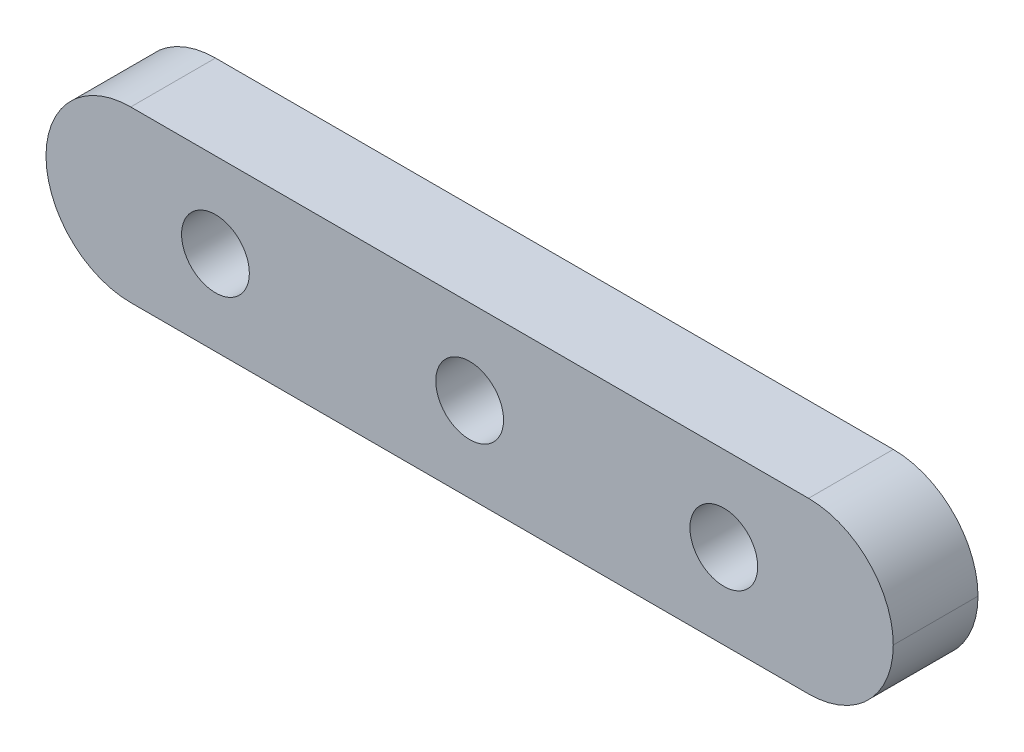
ISO-10303-21;
HEADER;
FILE_DESCRIPTION(('STEP AP214'),'2;1');
FILE_NAME('part.step','',(''),(''),'','','');
FILE_SCHEMA(('AUTOMOTIVE_DESIGN { 1 0 10303 214 1 1 1 1 }'));
ENDSEC;
DATA;
#1=APPLICATION_CONTEXT('core data for automotive mechanical design processes');
#2=APPLICATION_PROTOCOL_DEFINITION('international standard','automotive_design',2000,#1);
#3=PRODUCT_CONTEXT('',#1,'mechanical');
#4=PRODUCT('Part','Part','',(#3));
#5=PRODUCT_RELATED_PRODUCT_CATEGORY('part','',(#4));
#6=PRODUCT_DEFINITION_FORMATION('','',#4);
#7=PRODUCT_DEFINITION_CONTEXT('part definition',#1,'design');
#8=PRODUCT_DEFINITION('design','',#6,#7);
#9=PRODUCT_DEFINITION_SHAPE('','',#8);
#10=(LENGTH_UNIT() NAMED_UNIT(*) SI_UNIT(.MILLI.,.METRE.));
#11=(NAMED_UNIT(*) PLANE_ANGLE_UNIT() SI_UNIT($,.RADIAN.));
#12=(NAMED_UNIT(*) SI_UNIT($,.STERADIAN.) SOLID_ANGLE_UNIT());
#13=UNCERTAINTY_MEASURE_WITH_UNIT(LENGTH_MEASURE(1.E-05),#10,'distance_accuracy_value','');
#14=(GEOMETRIC_REPRESENTATION_CONTEXT(3) GLOBAL_UNCERTAINTY_ASSIGNED_CONTEXT((#13)) GLOBAL_UNIT_ASSIGNED_CONTEXT((#10,
#11,#12)) REPRESENTATION_CONTEXT('',''));
#15=CARTESIAN_POINT('',(0.,0.,0.));
#16=DIRECTION('',(0.,0.,1.));
#17=DIRECTION('',(1.,0.,0.));
#18=AXIS2_PLACEMENT_3D('',#15,#16,#17);
#19=CARTESIAN_POINT('',(0.,0.,5.));
#20=DIRECTION('',(0.,0.,1.));
#21=DIRECTION('',(1.,0.,0.));
#22=AXIS2_PLACEMENT_3D('',#19,#20,#21);
#23=PLANE('',#22);
#24=CARTESIAN_POINT('',(15.,0.,5.));
#25=DIRECTION('',(0.,0.,1.));
#26=DIRECTION('',(-1.,0.,0.));
#27=AXIS2_PLACEMENT_3D('',#24,#25,#26);
#28=CIRCLE('',#27,2.);
#29=CARTESIAN_POINT('',(13.,0.,5.));
#30=VERTEX_POINT('',#29);
#31=EDGE_CURVE('E181',#30,#30,#28,.T.);
#32=ORIENTED_EDGE('',*,*,#31,.F.);
#33=EDGE_LOOP('',(#32));
#34=FACE_BOUND('',#33,.T.);
#35=DIRECTION('',(1.,0.,0.));
#36=VECTOR('',#35,1.);
#37=CARTESIAN_POINT('',(-25.,-5.,5.));
#38=LINE('',#37,#36);
#39=CARTESIAN_POINT('',(-20.,-5.,5.));
#40=VERTEX_POINT('',#39);
#41=CARTESIAN_POINT('',(20.,-5.,5.));
#42=VERTEX_POINT('',#41);
#43=EDGE_CURVE('E145',#40,#42,#38,.T.);
#44=ORIENTED_EDGE('',*,*,#43,.T.);
#45=CARTESIAN_POINT('',(20.,0.,5.));
#46=DIRECTION('',(0.,0.,1.));
#47=DIRECTION('',(1.,0.,0.));
#48=AXIS2_PLACEMENT_3D('',#45,#46,#47);
#49=CIRCLE('',#48,5.);
#50=CARTESIAN_POINT('',(25.,0.,5.));
#51=VERTEX_POINT('',#50);
#52=EDGE_CURVE('E138',#42,#51,#49,.T.);
#53=ORIENTED_EDGE('',*,*,#52,.T.);
#54=CARTESIAN_POINT('',(20.,0.,5.));
#55=DIRECTION('',(0.,0.,1.));
#56=DIRECTION('',(1.,0.,0.));
#57=AXIS2_PLACEMENT_3D('',#54,#55,#56);
#58=CIRCLE('',#57,5.);
#59=CARTESIAN_POINT('',(20.,5.,5.));
#60=VERTEX_POINT('',#59);
#61=EDGE_CURVE('E113',#51,#60,#58,.T.);
#62=ORIENTED_EDGE('',*,*,#61,.T.);
#63=DIRECTION('',(-1.,0.,0.));
#64=VECTOR('',#63,1.);
#65=CARTESIAN_POINT('',(-25.,5.,5.));
#66=LINE('',#65,#64);
#67=CARTESIAN_POINT('',(-20.,5.,5.));
#68=VERTEX_POINT('',#67);
#69=EDGE_CURVE('E151',#60,#68,#66,.T.);
#70=ORIENTED_EDGE('',*,*,#69,.T.);
#71=CARTESIAN_POINT('',(-20.,0.,5.));
#72=DIRECTION('',(0.,0.,1.));
#73=DIRECTION('',(1.,0.,0.));
#74=AXIS2_PLACEMENT_3D('',#71,#72,#73);
#75=CIRCLE('',#74,5.);
#76=CARTESIAN_POINT('',(-25.,0.,5.));
#77=VERTEX_POINT('',#76);
#78=EDGE_CURVE('E57',#68,#77,#75,.T.);
#79=ORIENTED_EDGE('',*,*,#78,.T.);
#80=CARTESIAN_POINT('',(-20.,0.,5.));
#81=DIRECTION('',(0.,0.,1.));
#82=DIRECTION('',(1.,0.,0.));
#83=AXIS2_PLACEMENT_3D('',#80,#81,#82);
#84=CIRCLE('',#83,5.);
#85=EDGE_CURVE('E133',#77,#40,#84,.T.);
#86=ORIENTED_EDGE('',*,*,#85,.T.);
#87=EDGE_LOOP('',(#44,#53,#62,#70,#79,#86));
#88=FACE_BOUND('',#87,.T.);
#89=CARTESIAN_POINT('',(-15.,0.,5.));
#90=DIRECTION('',(0.,0.,1.));
#91=DIRECTION('',(1.,0.,0.));
#92=AXIS2_PLACEMENT_3D('',#89,#90,#91);
#93=CIRCLE('',#92,2.);
#94=CARTESIAN_POINT('',(-13.,0.,5.));
#95=VERTEX_POINT('',#94);
#96=EDGE_CURVE('E156',#95,#95,#93,.T.);
#97=ORIENTED_EDGE('',*,*,#96,.F.);
#98=EDGE_LOOP('',(#97));
#99=FACE_BOUND('',#98,.T.);
#100=CARTESIAN_POINT('',(0.,0.,5.));
#101=DIRECTION('',(0.,0.,1.));
#102=DIRECTION('',(1.,0.,0.));
#103=AXIS2_PLACEMENT_3D('',#100,#101,#102);
#104=CIRCLE('',#103,2.);
#105=CARTESIAN_POINT('',(2.,0.,5.));
#106=VERTEX_POINT('',#105);
#107=EDGE_CURVE('E173',#106,#106,#104,.T.);
#108=ORIENTED_EDGE('',*,*,#107,.F.);
#109=EDGE_LOOP('',(#108));
#110=FACE_BOUND('',#109,.T.);
#111=ADVANCED_FACE('F39',(#34,#88,#99,#110),#23,.T.);
#112=CARTESIAN_POINT('',(0.,0.,0.));
#113=DIRECTION('',(0.,0.,1.));
#114=DIRECTION('',(1.,0.,0.));
#115=AXIS2_PLACEMENT_3D('',#112,#113,#114);
#116=PLANE('',#115);
#117=CARTESIAN_POINT('',(20.,0.,0.));
#118=DIRECTION('',(0.,0.,1.));
#119=DIRECTION('',(1.,0.,0.));
#120=AXIS2_PLACEMENT_3D('',#117,#118,#119);
#121=CIRCLE('',#120,5.);
#122=CARTESIAN_POINT('',(20.,5.,0.));
#123=VERTEX_POINT('',#122);
#124=CARTESIAN_POINT('',(25.,0.,0.));
#125=VERTEX_POINT('',#124);
#126=EDGE_CURVE('E95',#123,#125,#121,.F.);
#127=ORIENTED_EDGE('',*,*,#126,.T.);
#128=CARTESIAN_POINT('',(20.,0.,0.));
#129=DIRECTION('',(0.,0.,1.));
#130=DIRECTION('',(1.,0.,0.));
#131=AXIS2_PLACEMENT_3D('',#128,#129,#130);
#132=CIRCLE('',#131,5.);
#133=CARTESIAN_POINT('',(20.,-5.,0.));
#134=VERTEX_POINT('',#133);
#135=EDGE_CURVE('E101',#125,#134,#132,.F.);
#136=ORIENTED_EDGE('',*,*,#135,.T.);
#137=DIRECTION('',(1.,0.,0.));
#138=VECTOR('',#137,1.);
#139=CARTESIAN_POINT('',(-25.,-5.,0.));
#140=LINE('',#139,#138);
#141=CARTESIAN_POINT('',(-20.,-5.,0.));
#142=VERTEX_POINT('',#141);
#143=EDGE_CURVE('E149',#142,#134,#140,.T.);
#144=ORIENTED_EDGE('',*,*,#143,.F.);
#145=CARTESIAN_POINT('',(-20.,0.,0.));
#146=DIRECTION('',(0.,0.,1.));
#147=DIRECTION('',(1.,0.,0.));
#148=AXIS2_PLACEMENT_3D('',#145,#146,#147);
#149=CIRCLE('',#148,5.);
#150=CARTESIAN_POINT('',(-25.,0.,0.));
#151=VERTEX_POINT('',#150);
#152=EDGE_CURVE('E107',#142,#151,#149,.F.);
#153=ORIENTED_EDGE('',*,*,#152,.T.);
#154=CARTESIAN_POINT('',(-20.,0.,0.));
#155=DIRECTION('',(0.,0.,1.));
#156=DIRECTION('',(1.,0.,0.));
#157=AXIS2_PLACEMENT_3D('',#154,#155,#156);
#158=CIRCLE('',#157,5.);
#159=CARTESIAN_POINT('',(-20.,5.,0.));
#160=VERTEX_POINT('',#159);
#161=EDGE_CURVE('E160',#151,#160,#158,.F.);
#162=ORIENTED_EDGE('',*,*,#161,.T.);
#163=DIRECTION('',(-1.,0.,0.));
#164=VECTOR('',#163,1.);
#165=CARTESIAN_POINT('',(-25.,5.,0.));
#166=LINE('',#165,#164);
#167=EDGE_CURVE('E103',#123,#160,#166,.T.);
#168=ORIENTED_EDGE('',*,*,#167,.F.);
#169=EDGE_LOOP('',(#127,#136,#144,#153,#162,#168));
#170=FACE_BOUND('',#169,.T.);
#171=CARTESIAN_POINT('',(-15.,0.,0.));
#172=DIRECTION('',(0.,0.,1.));
#173=DIRECTION('',(1.,0.,0.));
#174=AXIS2_PLACEMENT_3D('',#171,#172,#173);
#175=CIRCLE('',#174,2.);
#176=CARTESIAN_POINT('',(-13.,0.,0.));
#177=VERTEX_POINT('',#176);
#178=EDGE_CURVE('E185',#177,#177,#175,.T.);
#179=ORIENTED_EDGE('',*,*,#178,.T.);
#180=EDGE_LOOP('',(#179));
#181=FACE_BOUND('',#180,.T.);
#182=CARTESIAN_POINT('',(15.,0.,0.));
#183=DIRECTION('',(0.,0.,1.));
#184=DIRECTION('',(-1.,0.,0.));
#185=AXIS2_PLACEMENT_3D('',#182,#183,#184);
#186=CIRCLE('',#185,2.);
#187=CARTESIAN_POINT('',(13.,0.,0.));
#188=VERTEX_POINT('',#187);
#189=EDGE_CURVE('E177',#188,#188,#186,.T.);
#190=ORIENTED_EDGE('',*,*,#189,.T.);
#191=EDGE_LOOP('',(#190));
#192=FACE_BOUND('',#191,.T.);
#193=CARTESIAN_POINT('',(0.,0.,0.));
#194=DIRECTION('',(0.,0.,1.));
#195=DIRECTION('',(1.,0.,0.));
#196=AXIS2_PLACEMENT_3D('',#193,#194,#195);
#197=CIRCLE('',#196,2.);
#198=CARTESIAN_POINT('',(2.,0.,0.));
#199=VERTEX_POINT('',#198);
#200=EDGE_CURVE('E116',#199,#199,#197,.T.);
#201=ORIENTED_EDGE('',*,*,#200,.T.);
#202=EDGE_LOOP('',(#201));
#203=FACE_BOUND('',#202,.T.);
#204=ADVANCED_FACE('F97',(#170,#181,#192,#203),#116,.F.);
#205=CARTESIAN_POINT('',(-25.,5.,5.));
#206=DIRECTION('',(0.,-1.,0.));
#207=DIRECTION('',(0.,0.,-1.));
#208=AXIS2_PLACEMENT_3D('',#205,#206,#207);
#209=PLANE('',#208);
#210=ORIENTED_EDGE('',*,*,#69,.F.);
#211=DIRECTION('',(0.,0.,-1.));
#212=VECTOR('',#211,1.);
#213=CARTESIAN_POINT('',(20.,5.,5.));
#214=LINE('',#213,#212);
#215=EDGE_CURVE('E11',#60,#123,#214,.T.);
#216=ORIENTED_EDGE('',*,*,#215,.T.);
#217=ORIENTED_EDGE('',*,*,#167,.T.);
#218=DIRECTION('',(0.,0.,-1.));
#219=VECTOR('',#218,1.);
#220=CARTESIAN_POINT('',(-20.,5.,5.));
#221=LINE('',#220,#219);
#222=EDGE_CURVE('E49',#160,#68,#221,.F.);
#223=ORIENTED_EDGE('',*,*,#222,.T.);
#224=EDGE_LOOP('',(#210,#216,#217,#223));
#225=FACE_BOUND('',#224,.T.);
#226=ADVANCED_FACE('F211',(#225),#209,.F.);
#227=CARTESIAN_POINT('',(-25.,-5.,5.));
#228=DIRECTION('',(0.,1.,0.));
#229=DIRECTION('',(0.,0.,1.));
#230=AXIS2_PLACEMENT_3D('',#227,#228,#229);
#231=PLANE('',#230);
#232=ORIENTED_EDGE('',*,*,#143,.T.);
#233=DIRECTION('',(0.,0.,-1.));
#234=VECTOR('',#233,1.);
#235=CARTESIAN_POINT('',(20.,-5.,5.));
#236=LINE('',#235,#234);
#237=EDGE_CURVE('E120',#134,#42,#236,.F.);
#238=ORIENTED_EDGE('',*,*,#237,.T.);
#239=ORIENTED_EDGE('',*,*,#43,.F.);
#240=DIRECTION('',(0.,0.,-1.));
#241=VECTOR('',#240,1.);
#242=CARTESIAN_POINT('',(-20.,-5.,5.));
#243=LINE('',#242,#241);
#244=EDGE_CURVE('E122',#40,#142,#243,.T.);
#245=ORIENTED_EDGE('',*,*,#244,.T.);
#246=EDGE_LOOP('',(#232,#238,#239,#245));
#247=FACE_BOUND('',#246,.T.);
#248=ADVANCED_FACE('F147',(#247),#231,.F.);
#249=CARTESIAN_POINT('',(-15.,0.,5.));
#250=DIRECTION('',(0.,0.,-1.));
#251=DIRECTION('',(-1.,0.,0.));
#252=AXIS2_PLACEMENT_3D('',#249,#250,#251);
#253=CYLINDRICAL_SURFACE('',#252,2.);
#254=ORIENTED_EDGE('',*,*,#96,.T.);
#255=EDGE_LOOP('',(#254));
#256=FACE_BOUND('',#255,.T.);
#257=ORIENTED_EDGE('',*,*,#178,.F.);
#258=EDGE_LOOP('',(#257));
#259=FACE_BOUND('',#258,.T.);
#260=ADVANCED_FACE('F195',(#256,#259),#253,.F.);
#261=CARTESIAN_POINT('',(15.,0.,5.));
#262=DIRECTION('',(0.,0.,-1.));
#263=DIRECTION('',(-1.,0.,0.));
#264=AXIS2_PLACEMENT_3D('',#261,#262,#263);
#265=CYLINDRICAL_SURFACE('',#264,2.);
#266=ORIENTED_EDGE('',*,*,#31,.T.);
#267=EDGE_LOOP('',(#266));
#268=FACE_BOUND('',#267,.T.);
#269=ORIENTED_EDGE('',*,*,#189,.F.);
#270=EDGE_LOOP('',(#269));
#271=FACE_BOUND('',#270,.T.);
#272=ADVANCED_FACE('F206',(#268,#271),#265,.F.);
#273=CARTESIAN_POINT('',(0.,0.,5.));
#274=DIRECTION('',(0.,0.,-1.));
#275=DIRECTION('',(-1.,0.,0.));
#276=AXIS2_PLACEMENT_3D('',#273,#274,#275);
#277=CYLINDRICAL_SURFACE('',#276,2.);
#278=ORIENTED_EDGE('',*,*,#107,.T.);
#279=EDGE_LOOP('',(#278));
#280=FACE_BOUND('',#279,.T.);
#281=ORIENTED_EDGE('',*,*,#200,.F.);
#282=EDGE_LOOP('',(#281));
#283=FACE_BOUND('',#282,.T.);
#284=ADVANCED_FACE('F203',(#280,#283),#277,.F.);
#285=CARTESIAN_POINT('',(20.,0.,5.));
#286=DIRECTION('',(0.,0.,-1.));
#287=DIRECTION('',(-1.,0.,0.));
#288=AXIS2_PLACEMENT_3D('',#285,#286,#287);
#289=CYLINDRICAL_SURFACE('',#288,5.);
#290=ORIENTED_EDGE('',*,*,#215,.F.);
#291=ORIENTED_EDGE('',*,*,#61,.F.);
#292=DIRECTION('',(0.,0.,-1.));
#293=VECTOR('',#292,1.);
#294=CARTESIAN_POINT('',(25.,0.,5.));
#295=LINE('',#294,#293);
#296=EDGE_CURVE('E111',#125,#51,#295,.F.);
#297=ORIENTED_EDGE('',*,*,#296,.F.);
#298=ORIENTED_EDGE('',*,*,#126,.F.);
#299=EDGE_LOOP('',(#290,#291,#297,#298));
#300=FACE_BOUND('',#299,.T.);
#301=ADVANCED_FACE('F112',(#300),#289,.T.);
#302=CARTESIAN_POINT('',(20.,0.,5.));
#303=DIRECTION('',(0.,0.,-1.));
#304=DIRECTION('',(-1.,0.,0.));
#305=AXIS2_PLACEMENT_3D('',#302,#303,#304);
#306=CYLINDRICAL_SURFACE('',#305,5.);
#307=ORIENTED_EDGE('',*,*,#52,.F.);
#308=ORIENTED_EDGE('',*,*,#237,.F.);
#309=ORIENTED_EDGE('',*,*,#135,.F.);
#310=ORIENTED_EDGE('',*,*,#296,.T.);
#311=EDGE_LOOP('',(#307,#308,#309,#310));
#312=FACE_BOUND('',#311,.T.);
#313=ADVANCED_FACE('F118',(#312),#306,.T.);
#314=CARTESIAN_POINT('',(-20.,0.,5.));
#315=DIRECTION('',(0.,0.,-1.));
#316=DIRECTION('',(-1.,0.,0.));
#317=AXIS2_PLACEMENT_3D('',#314,#315,#316);
#318=CYLINDRICAL_SURFACE('',#317,5.);
#319=DIRECTION('',(0.,0.,-1.));
#320=VECTOR('',#319,1.);
#321=CARTESIAN_POINT('',(-25.,0.,5.));
#322=LINE('',#321,#320);
#323=EDGE_CURVE('E43',#77,#151,#322,.T.);
#324=ORIENTED_EDGE('',*,*,#323,.F.);
#325=ORIENTED_EDGE('',*,*,#78,.F.);
#326=ORIENTED_EDGE('',*,*,#222,.F.);
#327=ORIENTED_EDGE('',*,*,#161,.F.);
#328=EDGE_LOOP('',(#324,#325,#326,#327));
#329=FACE_BOUND('',#328,.T.);
#330=ADVANCED_FACE('F41',(#329),#318,.T.);
#331=CARTESIAN_POINT('',(-20.,0.,5.));
#332=DIRECTION('',(0.,0.,-1.));
#333=DIRECTION('',(-1.,0.,0.));
#334=AXIS2_PLACEMENT_3D('',#331,#332,#333);
#335=CYLINDRICAL_SURFACE('',#334,5.);
#336=ORIENTED_EDGE('',*,*,#85,.F.);
#337=ORIENTED_EDGE('',*,*,#323,.T.);
#338=ORIENTED_EDGE('',*,*,#152,.F.);
#339=ORIENTED_EDGE('',*,*,#244,.F.);
#340=EDGE_LOOP('',(#336,#337,#338,#339));
#341=FACE_BOUND('',#340,.T.);
#342=ADVANCED_FACE('F168',(#341),#335,.T.);
#343=CLOSED_SHELL('',(#111,#204,#226,#248,#260,#272,#284,#301,#313,#330,#342));
#344=MANIFOLD_SOLID_BREP('B2',#343);
#345=ADVANCED_BREP_SHAPE_REPRESENTATION('',(#18,#344),#14);
#346=SHAPE_DEFINITION_REPRESENTATION(#9,#345);
ENDSEC;
END-ISO-10303-21;
